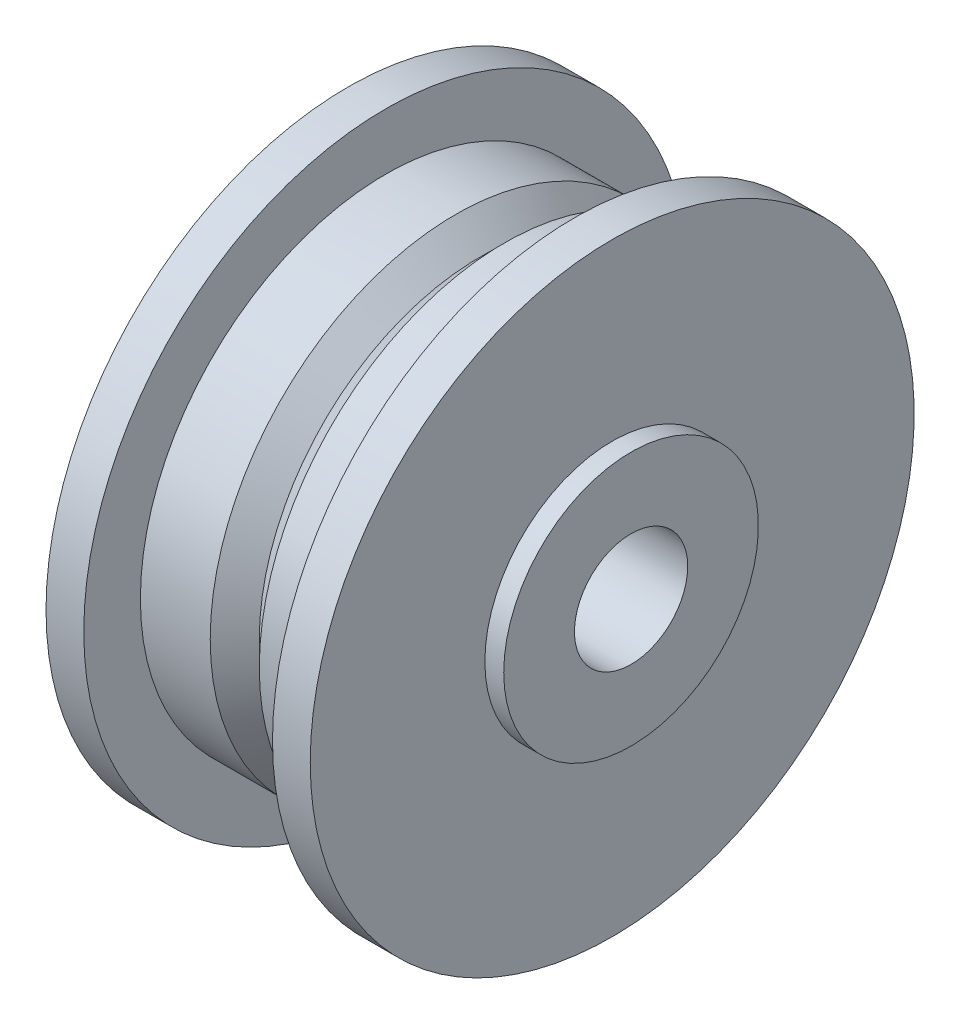
ISO-10303-21;
HEADER;
FILE_DESCRIPTION(('STEP AP214'),'2;1');
FILE_NAME('part.step','',(''),(''),'','','');
FILE_SCHEMA(('AUTOMOTIVE_DESIGN { 1 0 10303 214 1 1 1 1 }'));
ENDSEC;
DATA;
#1=APPLICATION_CONTEXT('core data for automotive mechanical design processes');
#2=APPLICATION_PROTOCOL_DEFINITION('international standard','automotive_design',2000,#1);
#3=PRODUCT_CONTEXT('',#1,'mechanical');
#4=PRODUCT('Part','Part','',(#3));
#5=PRODUCT_RELATED_PRODUCT_CATEGORY('part','',(#4));
#6=PRODUCT_DEFINITION_FORMATION('','',#4);
#7=PRODUCT_DEFINITION_CONTEXT('part definition',#1,'design');
#8=PRODUCT_DEFINITION('design','',#6,#7);
#9=PRODUCT_DEFINITION_SHAPE('','',#8);
#10=(LENGTH_UNIT() NAMED_UNIT(*) SI_UNIT(.MILLI.,.METRE.));
#11=(NAMED_UNIT(*) PLANE_ANGLE_UNIT() SI_UNIT($,.RADIAN.));
#12=(NAMED_UNIT(*) SI_UNIT($,.STERADIAN.) SOLID_ANGLE_UNIT());
#13=UNCERTAINTY_MEASURE_WITH_UNIT(LENGTH_MEASURE(1.E-05),#10,'distance_accuracy_value','');
#14=(GEOMETRIC_REPRESENTATION_CONTEXT(3) GLOBAL_UNCERTAINTY_ASSIGNED_CONTEXT((#13)) GLOBAL_UNIT_ASSIGNED_CONTEXT((#10,
#11,#12)) REPRESENTATION_CONTEXT('',''));
#15=CARTESIAN_POINT('',(0.,0.,0.));
#16=DIRECTION('',(0.,0.,1.));
#17=DIRECTION('',(1.,0.,0.));
#18=AXIS2_PLACEMENT_3D('',#15,#16,#17);
#19=CARTESIAN_POINT('',(0.,0.,0.));
#20=DIRECTION('',(1.,0.,0.));
#21=DIRECTION('',(0.,0.,-1.));
#22=AXIS2_PLACEMENT_3D('',#19,#20,#21);
#23=PLANE('',#22);
#24=CARTESIAN_POINT('',(0.,0.,0.));
#25=DIRECTION('',(1.,0.,0.));
#26=DIRECTION('',(0.,0.,-1.));
#27=AXIS2_PLACEMENT_3D('',#24,#25,#26);
#28=CIRCLE('',#27,30.);
#29=CARTESIAN_POINT('',(0.,0.,-30.0000000000001));
#30=VERTEX_POINT('',#29);
#31=EDGE_CURVE('E102',#30,#30,#28,.T.);
#32=ORIENTED_EDGE('',*,*,#31,.T.);
#33=EDGE_LOOP('',(#32));
#34=FACE_BOUND('',#33,.T.);
#35=CARTESIAN_POINT('',(0.,0.,0.));
#36=DIRECTION('',(-1.,0.,0.));
#37=DIRECTION('',(0.,0.,1.));
#38=AXIS2_PLACEMENT_3D('',#35,#36,#37);
#39=CIRCLE('',#38,67.4757281553399);
#40=CARTESIAN_POINT('',(0.,0.,67.4757281553401));
#41=VERTEX_POINT('',#40);
#42=EDGE_CURVE('E10',#41,#41,#39,.T.);
#43=ORIENTED_EDGE('',*,*,#42,.T.);
#44=EDGE_LOOP('',(#43));
#45=FACE_BOUND('',#44,.T.);
#46=ADVANCED_FACE('F41',(#34,#45),#23,.F.);
#47=CARTESIAN_POINT('',(0.,0.,0.));
#48=DIRECTION('',(-1.,0.,0.));
#49=DIRECTION('',(0.,0.,1.));
#50=AXIS2_PLACEMENT_3D('',#47,#48,#49);
#51=CYLINDRICAL_SURFACE('',#50,67.4757281553399);
#52=ORIENTED_EDGE('',*,*,#42,.F.);
#53=EDGE_LOOP('',(#52));
#54=FACE_BOUND('',#53,.T.);
#55=CARTESIAN_POINT('',(10.,0.,0.));
#56=DIRECTION('',(-1.,0.,0.));
#57=DIRECTION('',(0.,0.,1.));
#58=AXIS2_PLACEMENT_3D('',#55,#56,#57);
#59=CIRCLE('',#58,67.4757281553399);
#60=CARTESIAN_POINT('',(10.,0.,67.4757281553401));
#61=VERTEX_POINT('',#60);
#62=EDGE_CURVE('E48',#61,#61,#59,.T.);
#63=ORIENTED_EDGE('',*,*,#62,.T.);
#64=EDGE_LOOP('',(#63));
#65=FACE_BOUND('',#64,.T.);
#66=ADVANCED_FACE('F138',(#54,#65),#51,.T.);
#67=CARTESIAN_POINT('',(10.,67.47572815534,1.66533453693773E-13));
#68=DIRECTION('',(1.,0.,0.));
#69=DIRECTION('',(0.,0.,-1.));
#70=AXIS2_PLACEMENT_3D('',#67,#68,#69);
#71=PLANE('',#70);
#72=ORIENTED_EDGE('',*,*,#62,.F.);
#73=EDGE_LOOP('',(#72));
#74=FACE_BOUND('',#73,.T.);
#75=CARTESIAN_POINT('',(10.,0.,0.));
#76=DIRECTION('',(-1.,0.,0.));
#77=DIRECTION('',(0.,0.,1.));
#78=AXIS2_PLACEMENT_3D('',#75,#76,#77);
#79=CIRCLE('',#78,160.);
#80=CARTESIAN_POINT('',(10.,0.,160.000000000001));
#81=VERTEX_POINT('',#80);
#82=EDGE_CURVE('E54',#81,#81,#79,.T.);
#83=ORIENTED_EDGE('',*,*,#82,.T.);
#84=EDGE_LOOP('',(#83));
#85=FACE_BOUND('',#84,.T.);
#86=ADVANCED_FACE('F142',(#74,#85),#71,.F.);
#87=CARTESIAN_POINT('',(0.,0.,0.));
#88=DIRECTION('',(-1.,0.,0.));
#89=DIRECTION('',(0.,0.,1.));
#90=AXIS2_PLACEMENT_3D('',#87,#88,#89);
#91=CYLINDRICAL_SURFACE('',#90,160.);
#92=ORIENTED_EDGE('',*,*,#82,.F.);
#93=EDGE_LOOP('',(#92));
#94=FACE_BOUND('',#93,.T.);
#95=CARTESIAN_POINT('',(30.,0.,0.));
#96=DIRECTION('',(-1.,0.,0.));
#97=DIRECTION('',(0.,0.,1.));
#98=AXIS2_PLACEMENT_3D('',#95,#96,#97);
#99=CIRCLE('',#98,160.);
#100=CARTESIAN_POINT('',(30.,0.,160.000000000001));
#101=VERTEX_POINT('',#100);
#102=EDGE_CURVE('E60',#101,#101,#99,.T.);
#103=ORIENTED_EDGE('',*,*,#102,.T.);
#104=EDGE_LOOP('',(#103));
#105=FACE_BOUND('',#104,.T.);
#106=ADVANCED_FACE('F147',(#94,#105),#91,.T.);
#107=CARTESIAN_POINT('',(30.,160.,1.66533453693773E-13));
#108=DIRECTION('',(-1.,0.,0.));
#109=DIRECTION('',(0.,0.,1.));
#110=AXIS2_PLACEMENT_3D('',#107,#108,#109);
#111=PLANE('',#110);
#112=ORIENTED_EDGE('',*,*,#102,.F.);
#113=EDGE_LOOP('',(#112));
#114=FACE_BOUND('',#113,.T.);
#115=CARTESIAN_POINT('',(30.,0.,0.));
#116=DIRECTION('',(-1.,0.,0.));
#117=DIRECTION('',(0.,0.,1.));
#118=AXIS2_PLACEMENT_3D('',#115,#116,#117);
#119=CIRCLE('',#118,130.);
#120=CARTESIAN_POINT('',(30.,0.,130.));
#121=VERTEX_POINT('',#120);
#122=EDGE_CURVE('E66',#121,#121,#119,.T.);
#123=ORIENTED_EDGE('',*,*,#122,.T.);
#124=EDGE_LOOP('',(#123));
#125=FACE_BOUND('',#124,.T.);
#126=ADVANCED_FACE('F153',(#114,#125),#111,.F.);
#127=CARTESIAN_POINT('',(0.,0.,0.));
#128=DIRECTION('',(-1.,0.,0.));
#129=DIRECTION('',(0.,0.,1.));
#130=AXIS2_PLACEMENT_3D('',#127,#128,#129);
#131=CYLINDRICAL_SURFACE('',#130,130.);
#132=ORIENTED_EDGE('',*,*,#122,.F.);
#133=EDGE_LOOP('',(#132));
#134=FACE_BOUND('',#133,.T.);
#135=CARTESIAN_POINT('',(67.,0.,0.));
#136=DIRECTION('',(-1.,0.,0.));
#137=DIRECTION('',(0.,0.,1.));
#138=AXIS2_PLACEMENT_3D('',#135,#136,#137);
#139=CIRCLE('',#138,130.);
#140=CARTESIAN_POINT('',(67.,0.,130.));
#141=VERTEX_POINT('',#140);
#142=EDGE_CURVE('E70',#141,#141,#139,.T.);
#143=ORIENTED_EDGE('',*,*,#142,.T.);
#144=EDGE_LOOP('',(#143));
#145=FACE_BOUND('',#144,.T.);
#146=ADVANCED_FACE('F157',(#134,#145),#131,.T.);
#147=CARTESIAN_POINT('',(80.,0.,0.));
#148=DIRECTION('',(-1.,0.,0.));
#149=DIRECTION('',(0.,0.,1.));
#150=AXIS2_PLACEMENT_3D('',#147,#148,#149);
#151=CONICAL_SURFACE('',#150,117.,0.785398163397448);
#152=ORIENTED_EDGE('',*,*,#142,.F.);
#153=EDGE_LOOP('',(#152));
#154=FACE_BOUND('',#153,.T.);
#155=CARTESIAN_POINT('',(80.,0.,0.));
#156=DIRECTION('',(-1.,0.,0.));
#157=DIRECTION('',(0.,0.,1.));
#158=AXIS2_PLACEMENT_3D('',#155,#156,#157);
#159=CIRCLE('',#158,117.);
#160=CARTESIAN_POINT('',(80.,0.,117.));
#161=VERTEX_POINT('',#160);
#162=EDGE_CURVE('E74',#161,#161,#159,.T.);
#163=ORIENTED_EDGE('',*,*,#162,.T.);
#164=EDGE_LOOP('',(#163));
#165=FACE_BOUND('',#164,.T.);
#166=ADVANCED_FACE('F161',(#154,#165),#151,.T.);
#167=CARTESIAN_POINT('',(93.,0.,0.));
#168=DIRECTION('',(1.,0.,0.));
#169=DIRECTION('',(0.,0.,-1.));
#170=AXIS2_PLACEMENT_3D('',#167,#168,#169);
#171=CONICAL_SURFACE('',#170,130.,0.785398163397448);
#172=ORIENTED_EDGE('',*,*,#162,.F.);
#173=EDGE_LOOP('',(#172));
#174=FACE_BOUND('',#173,.T.);
#175=CARTESIAN_POINT('',(93.,0.,0.));
#176=DIRECTION('',(-1.,0.,0.));
#177=DIRECTION('',(0.,0.,1.));
#178=AXIS2_PLACEMENT_3D('',#175,#176,#177);
#179=CIRCLE('',#178,130.);
#180=CARTESIAN_POINT('',(93.,0.,130.));
#181=VERTEX_POINT('',#180);
#182=EDGE_CURVE('E78',#181,#181,#179,.T.);
#183=ORIENTED_EDGE('',*,*,#182,.T.);
#184=EDGE_LOOP('',(#183));
#185=FACE_BOUND('',#184,.T.);
#186=ADVANCED_FACE('F165',(#174,#185),#171,.T.);
#187=CARTESIAN_POINT('',(0.,0.,0.));
#188=DIRECTION('',(-1.,0.,0.));
#189=DIRECTION('',(0.,0.,1.));
#190=AXIS2_PLACEMENT_3D('',#187,#188,#189);
#191=CYLINDRICAL_SURFACE('',#190,130.);
#192=ORIENTED_EDGE('',*,*,#182,.F.);
#193=EDGE_LOOP('',(#192));
#194=FACE_BOUND('',#193,.T.);
#195=CARTESIAN_POINT('',(130.,0.,0.));
#196=DIRECTION('',(-1.,0.,0.));
#197=DIRECTION('',(0.,0.,1.));
#198=AXIS2_PLACEMENT_3D('',#195,#196,#197);
#199=CIRCLE('',#198,130.);
#200=CARTESIAN_POINT('',(130.,0.,130.));
#201=VERTEX_POINT('',#200);
#202=EDGE_CURVE('E82',#201,#201,#199,.T.);
#203=ORIENTED_EDGE('',*,*,#202,.T.);
#204=EDGE_LOOP('',(#203));
#205=FACE_BOUND('',#204,.T.);
#206=ADVANCED_FACE('F169',(#194,#205),#191,.T.);
#207=CARTESIAN_POINT('',(130.,130.000000000001,0.));
#208=DIRECTION('',(1.,0.,0.));
#209=DIRECTION('',(0.,0.,-1.));
#210=AXIS2_PLACEMENT_3D('',#207,#208,#209);
#211=PLANE('',#210);
#212=ORIENTED_EDGE('',*,*,#202,.F.);
#213=EDGE_LOOP('',(#212));
#214=FACE_BOUND('',#213,.T.);
#215=CARTESIAN_POINT('',(130.,0.,0.));
#216=DIRECTION('',(-1.,0.,0.));
#217=DIRECTION('',(0.,0.,1.));
#218=AXIS2_PLACEMENT_3D('',#215,#216,#217);
#219=CIRCLE('',#218,160.);
#220=CARTESIAN_POINT('',(130.,0.,160.000000000001));
#221=VERTEX_POINT('',#220);
#222=EDGE_CURVE('E86',#221,#221,#219,.T.);
#223=ORIENTED_EDGE('',*,*,#222,.T.);
#224=EDGE_LOOP('',(#223));
#225=FACE_BOUND('',#224,.T.);
#226=ADVANCED_FACE('F173',(#214,#225),#211,.F.);
#227=CARTESIAN_POINT('',(0.,0.,0.));
#228=DIRECTION('',(-1.,0.,0.));
#229=DIRECTION('',(0.,0.,1.));
#230=AXIS2_PLACEMENT_3D('',#227,#228,#229);
#231=CYLINDRICAL_SURFACE('',#230,160.);
#232=ORIENTED_EDGE('',*,*,#222,.F.);
#233=EDGE_LOOP('',(#232));
#234=FACE_BOUND('',#233,.T.);
#235=CARTESIAN_POINT('',(150.,0.,0.));
#236=DIRECTION('',(-1.,0.,0.));
#237=DIRECTION('',(0.,0.,1.));
#238=AXIS2_PLACEMENT_3D('',#235,#236,#237);
#239=CIRCLE('',#238,160.);
#240=CARTESIAN_POINT('',(150.,0.,160.000000000001));
#241=VERTEX_POINT('',#240);
#242=EDGE_CURVE('E90',#241,#241,#239,.T.);
#243=ORIENTED_EDGE('',*,*,#242,.T.);
#244=EDGE_LOOP('',(#243));
#245=FACE_BOUND('',#244,.T.);
#246=ADVANCED_FACE('F133',(#234,#245),#231,.T.);
#247=CARTESIAN_POINT('',(150.,160.,2.77555756156289E-13));
#248=DIRECTION('',(-1.,0.,0.));
#249=DIRECTION('',(0.,0.,1.));
#250=AXIS2_PLACEMENT_3D('',#247,#248,#249);
#251=PLANE('',#250);
#252=ORIENTED_EDGE('',*,*,#242,.F.);
#253=EDGE_LOOP('',(#252));
#254=FACE_BOUND('',#253,.T.);
#255=CARTESIAN_POINT('',(150.,0.,0.));
#256=DIRECTION('',(-1.,0.,0.));
#257=DIRECTION('',(0.,0.,1.));
#258=AXIS2_PLACEMENT_3D('',#255,#256,#257);
#259=CIRCLE('',#258,67.4757281553399);
#260=CARTESIAN_POINT('',(150.,0.,67.4757281553401));
#261=VERTEX_POINT('',#260);
#262=EDGE_CURVE('E94',#261,#261,#259,.T.);
#263=ORIENTED_EDGE('',*,*,#262,.T.);
#264=EDGE_LOOP('',(#263));
#265=FACE_BOUND('',#264,.T.);
#266=ADVANCED_FACE('F127',(#254,#265),#251,.F.);
#267=CARTESIAN_POINT('',(0.,0.,0.));
#268=DIRECTION('',(-1.,0.,0.));
#269=DIRECTION('',(0.,0.,1.));
#270=AXIS2_PLACEMENT_3D('',#267,#268,#269);
#271=CYLINDRICAL_SURFACE('',#270,67.47572815534);
#272=ORIENTED_EDGE('',*,*,#262,.F.);
#273=EDGE_LOOP('',(#272));
#274=FACE_BOUND('',#273,.T.);
#275=CARTESIAN_POINT('',(160.,0.,0.));
#276=DIRECTION('',(-1.,0.,0.));
#277=DIRECTION('',(0.,0.,1.));
#278=AXIS2_PLACEMENT_3D('',#275,#276,#277);
#279=CIRCLE('',#278,67.47572815534);
#280=CARTESIAN_POINT('',(160.,0.,67.4757281553402));
#281=VERTEX_POINT('',#280);
#282=EDGE_CURVE('E98',#281,#281,#279,.T.);
#283=ORIENTED_EDGE('',*,*,#282,.T.);
#284=EDGE_LOOP('',(#283));
#285=FACE_BOUND('',#284,.T.);
#286=ADVANCED_FACE('F122',(#274,#285),#271,.T.);
#287=CARTESIAN_POINT('',(160.,67.4757281553401,2.77555756156289E-13));
#288=DIRECTION('',(-1.,0.,0.));
#289=DIRECTION('',(0.,0.,1.));
#290=AXIS2_PLACEMENT_3D('',#287,#288,#289);
#291=PLANE('',#290);
#292=CARTESIAN_POINT('',(160.,0.,0.));
#293=DIRECTION('',(1.,0.,0.));
#294=DIRECTION('',(0.,0.,-1.));
#295=AXIS2_PLACEMENT_3D('',#292,#293,#294);
#296=CIRCLE('',#295,30.);
#297=CARTESIAN_POINT('',(160.,0.,-30.0000000000001));
#298=VERTEX_POINT('',#297);
#299=EDGE_CURVE('E103',#298,#298,#296,.T.);
#300=ORIENTED_EDGE('',*,*,#299,.F.);
#301=EDGE_LOOP('',(#300));
#302=FACE_BOUND('',#301,.T.);
#303=ORIENTED_EDGE('',*,*,#282,.F.);
#304=EDGE_LOOP('',(#303));
#305=FACE_BOUND('',#304,.T.);
#306=ADVANCED_FACE('F116',(#302,#305),#291,.F.);
#307=CARTESIAN_POINT('',(0.,0.,0.));
#308=DIRECTION('',(1.,0.,0.));
#309=DIRECTION('',(0.,0.,-1.));
#310=AXIS2_PLACEMENT_3D('',#307,#308,#309);
#311=CYLINDRICAL_SURFACE('',#310,30.);
#312=ORIENTED_EDGE('',*,*,#31,.F.);
#313=EDGE_LOOP('',(#312));
#314=FACE_BOUND('',#313,.T.);
#315=ORIENTED_EDGE('',*,*,#299,.T.);
#316=EDGE_LOOP('',(#315));
#317=FACE_BOUND('',#316,.T.);
#318=ADVANCED_FACE('F113',(#314,#317),#311,.F.);
#319=CLOSED_SHELL('',(#46,#66,#86,#106,#126,#146,#166,#186,#206,#226,#246,#266,#286,#306,#318));
#320=MANIFOLD_SOLID_BREP('B2',#319);
#321=ADVANCED_BREP_SHAPE_REPRESENTATION('',(#18,#320),#14);
#322=SHAPE_DEFINITION_REPRESENTATION(#9,#321);
ENDSEC;
END-ISO-10303-21;
